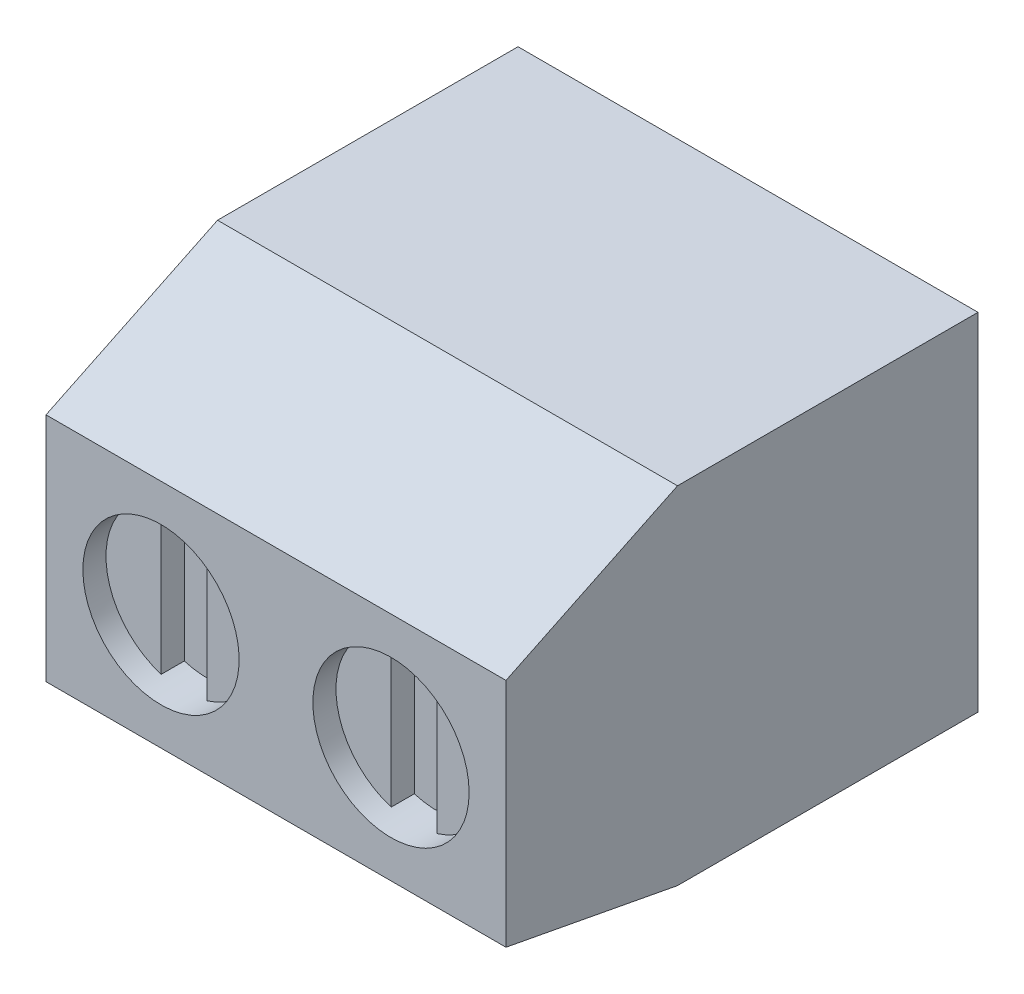
ISO-10303-21;
HEADER;
FILE_DESCRIPTION(('STEP AP214'),'2;1');
FILE_NAME('part.step','',(''),(''),'','','');
FILE_SCHEMA(('AUTOMOTIVE_DESIGN { 1 0 10303 214 1 1 1 1 }'));
ENDSEC;
DATA;
#1=APPLICATION_CONTEXT('core data for automotive mechanical design processes');
#2=APPLICATION_PROTOCOL_DEFINITION('international standard','automotive_design',2000,#1);
#3=PRODUCT_CONTEXT('',#1,'mechanical');
#4=PRODUCT('Part','Part','',(#3));
#5=PRODUCT_RELATED_PRODUCT_CATEGORY('part','',(#4));
#6=PRODUCT_DEFINITION_FORMATION('','',#4);
#7=PRODUCT_DEFINITION_CONTEXT('part definition',#1,'design');
#8=PRODUCT_DEFINITION('design','',#6,#7);
#9=PRODUCT_DEFINITION_SHAPE('','',#8);
#10=(LENGTH_UNIT() NAMED_UNIT(*) SI_UNIT(.MILLI.,.METRE.));
#11=(NAMED_UNIT(*) PLANE_ANGLE_UNIT() SI_UNIT($,.RADIAN.));
#12=(NAMED_UNIT(*) SI_UNIT($,.STERADIAN.) SOLID_ANGLE_UNIT());
#13=UNCERTAINTY_MEASURE_WITH_UNIT(LENGTH_MEASURE(1.E-05),#10,'distance_accuracy_value','');
#14=(GEOMETRIC_REPRESENTATION_CONTEXT(3) GLOBAL_UNCERTAINTY_ASSIGNED_CONTEXT((#13)) GLOBAL_UNIT_ASSIGNED_CONTEXT((#10,
#11,#12)) REPRESENTATION_CONTEXT('',''));
#15=CARTESIAN_POINT('',(0.,0.,0.));
#16=DIRECTION('',(0.,0.,1.));
#17=DIRECTION('',(1.,0.,0.));
#18=AXIS2_PLACEMENT_3D('',#15,#16,#17);
#19=CARTESIAN_POINT('',(-7.4625,3.1997519769774,9.71));
#20=DIRECTION('',(0.,0.,-1.));
#21=DIRECTION('',(-1.,0.,0.));
#22=AXIS2_PLACEMENT_3D('',#19,#20,#21);
#23=PLANE('',#22);
#24=DIRECTION('',(0.,1.,0.));
#25=VECTOR('',#24,1.);
#26=CARTESIAN_POINT('',(-6.96704564957599,1.58400911790423,9.71));
#27=LINE('',#26,#25);
#28=CARTESIAN_POINT('',(-6.96704564957599,1.58400911790423,9.71));
#29=VERTEX_POINT('',#28);
#30=CARTESIAN_POINT('',(-6.96704564957599,4.81549483605056,9.71));
#31=VERTEX_POINT('',#30);
#32=EDGE_CURVE('E294',#29,#31,#27,.T.);
#33=ORIENTED_EDGE('',*,*,#32,.F.);
#34=CARTESIAN_POINT('',(-7.4625,3.1997519769774,9.71));
#35=DIRECTION('',(0.,0.,1.));
#36=DIRECTION('',(-1.,0.,0.));
#37=AXIS2_PLACEMENT_3D('',#34,#35,#36);
#38=CIRCLE('',#37,1.69);
#39=EDGE_CURVE('E346',#29,#31,#38,.T.);
#40=ORIENTED_EDGE('',*,*,#39,.T.);
#41=EDGE_LOOP('',(#33,#40));
#42=FACE_BOUND('',#41,.T.);
#43=ADVANCED_FACE('F33',(#42),#23,.F.);
#44=DIRECTION('',(0.,-1.,0.));
#45=VECTOR('',#44,1.);
#46=CARTESIAN_POINT('',(-7.95795435042401,1.58400911790423,9.71));
#47=LINE('',#46,#45);
#48=CARTESIAN_POINT('',(-7.95795435042401,4.81549483605056,9.71));
#49=VERTEX_POINT('',#48);
#50=CARTESIAN_POINT('',(-7.95795435042401,1.58400911790423,9.71));
#51=VERTEX_POINT('',#50);
#52=EDGE_CURVE('E304',#49,#51,#47,.T.);
#53=ORIENTED_EDGE('',*,*,#52,.F.);
#54=EDGE_CURVE('E342',#49,#51,#38,.T.);
#55=ORIENTED_EDGE('',*,*,#54,.T.);
#56=EDGE_LOOP('',(#53,#55));
#57=FACE_BOUND('',#56,.T.);
#58=ADVANCED_FACE('F511',(#57),#23,.F.);
#59=CARTESIAN_POINT('',(-2.4875,3.1997519769774,9.71));
#60=DIRECTION('',(0.,0.,1.));
#61=DIRECTION('',(1.,0.,0.));
#62=AXIS2_PLACEMENT_3D('',#59,#60,#61);
#63=PLANE('',#62);
#64=DIRECTION('',(0.,-1.,0.));
#65=VECTOR('',#64,1.);
#66=CARTESIAN_POINT('',(-2.98295435042401,1.58400911790423,9.71));
#67=LINE('',#66,#65);
#68=CARTESIAN_POINT('',(-2.98295435042401,4.81549483605056,9.71));
#69=VERTEX_POINT('',#68);
#70=CARTESIAN_POINT('',(-2.98295435042401,1.58400911790423,9.71));
#71=VERTEX_POINT('',#70);
#72=EDGE_CURVE('E337',#69,#71,#67,.T.);
#73=ORIENTED_EDGE('',*,*,#72,.F.);
#74=CARTESIAN_POINT('',(-2.4875,3.1997519769774,9.71));
#75=DIRECTION('',(0.,0.,1.));
#76=DIRECTION('',(1.,0.,0.));
#77=AXIS2_PLACEMENT_3D('',#74,#75,#76);
#78=CIRCLE('',#77,1.69);
#79=EDGE_CURVE('E407',#69,#71,#78,.T.);
#80=ORIENTED_EDGE('',*,*,#79,.T.);
#81=EDGE_LOOP('',(#73,#80));
#82=FACE_BOUND('',#81,.T.);
#83=ADVANCED_FACE('F517',(#82),#63,.T.);
#84=CARTESIAN_POINT('',(0.,0.,10.21));
#85=DIRECTION('',(-1.,0.,0.));
#86=DIRECTION('',(0.,0.,1.));
#87=AXIS2_PLACEMENT_3D('',#84,#85,#86);
#88=PLANE('',#87);
#89=DIRECTION('',(0.,1.,0.));
#90=VECTOR('',#89,1.);
#91=CARTESIAN_POINT('',(0.,0.,10.21));
#92=LINE('',#91,#90);
#93=CARTESIAN_POINT('',(0.,0.699999999999996,10.21));
#94=VERTEX_POINT('',#93);
#95=CARTESIAN_POINT('',(0.,5.6995039539548,10.21));
#96=VERTEX_POINT('',#95);
#97=EDGE_CURVE('E432',#94,#96,#92,.T.);
#98=ORIENTED_EDGE('',*,*,#97,.F.);
#99=DIRECTION('',(0.,-0.185407859197824,-0.982661653748471));
#100=VECTOR('',#99,1.);
#101=CARTESIAN_POINT('',(0.,0.699999999999996,10.21));
#102=LINE('',#101,#100);
#103=CARTESIAN_POINT('',(0.,0.,6.5));
#104=VERTEX_POINT('',#103);
#105=EDGE_CURVE('E439',#94,#104,#102,.T.);
#106=ORIENTED_EDGE('',*,*,#105,.T.);
#107=DIRECTION('',(0.,0.,-1.));
#108=VECTOR('',#107,1.);
#109=CARTESIAN_POINT('',(0.,0.,10.21));
#110=LINE('',#109,#108);
#111=CARTESIAN_POINT('',(0.,0.,0.));
#112=VERTEX_POINT('',#111);
#113=EDGE_CURVE('E449',#104,#112,#110,.T.);
#114=ORIENTED_EDGE('',*,*,#113,.T.);
#115=DIRECTION('',(0.,1.,0.));
#116=VECTOR('',#115,1.);
#117=CARTESIAN_POINT('',(0.,0.,0.));
#118=LINE('',#117,#116);
#119=CARTESIAN_POINT('',(0.,7.49,0.));
#120=VERTEX_POINT('',#119);
#121=EDGE_CURVE('E458',#112,#120,#118,.T.);
#122=ORIENTED_EDGE('',*,*,#121,.T.);
#123=DIRECTION('',(0.,0.,-1.));
#124=VECTOR('',#123,1.);
#125=CARTESIAN_POINT('',(0.,7.49,10.21));
#126=LINE('',#125,#124);
#127=CARTESIAN_POINT('',(0.,7.49,6.5));
#128=VERTEX_POINT('',#127);
#129=EDGE_CURVE('E11',#128,#120,#126,.T.);
#130=ORIENTED_EDGE('',*,*,#129,.F.);
#131=DIRECTION('',(0.,-0.434643061495688,0.90060280317888));
#132=VECTOR('',#131,1.);
#133=CARTESIAN_POINT('',(0.,7.49,6.5));
#134=LINE('',#133,#132);
#135=EDGE_CURVE('E446',#128,#96,#134,.T.);
#136=ORIENTED_EDGE('',*,*,#135,.T.);
#137=EDGE_LOOP('',(#98,#106,#114,#122,#130,#136));
#138=FACE_BOUND('',#137,.T.);
#139=ADVANCED_FACE('F35',(#138),#88,.F.);
#140=CARTESIAN_POINT('',(0.,7.49,10.21));
#141=DIRECTION('',(0.,-1.,0.));
#142=DIRECTION('',(1.,0.,0.));
#143=AXIS2_PLACEMENT_3D('',#140,#141,#142);
#144=PLANE('',#143);
#145=DIRECTION('',(0.,0.,-1.));
#146=VECTOR('',#145,1.);
#147=CARTESIAN_POINT('',(-9.95,7.49,10.21));
#148=LINE('',#147,#146);
#149=CARTESIAN_POINT('',(-9.95,7.49,6.5));
#150=VERTEX_POINT('',#149);
#151=CARTESIAN_POINT('',(-9.95,7.49,0.));
#152=VERTEX_POINT('',#151);
#153=EDGE_CURVE('E42',#150,#152,#148,.T.);
#154=ORIENTED_EDGE('',*,*,#153,.F.);
#155=DIRECTION('',(-1.,0.,0.));
#156=VECTOR('',#155,1.);
#157=CARTESIAN_POINT('',(0.,7.49,6.5));
#158=LINE('',#157,#156);
#159=EDGE_CURVE('E455',#128,#150,#158,.T.);
#160=ORIENTED_EDGE('',*,*,#159,.F.);
#161=ORIENTED_EDGE('',*,*,#129,.T.);
#162=DIRECTION('',(-1.,0.,0.));
#163=VECTOR('',#162,1.);
#164=CARTESIAN_POINT('',(0.,7.49,0.));
#165=LINE('',#164,#163);
#166=EDGE_CURVE('E461',#120,#152,#165,.T.);
#167=ORIENTED_EDGE('',*,*,#166,.T.);
#168=EDGE_LOOP('',(#154,#160,#161,#167));
#169=FACE_BOUND('',#168,.T.);
#170=ADVANCED_FACE('F483',(#169),#144,.F.);
#171=CARTESIAN_POINT('',(-9.95,0.,10.21));
#172=DIRECTION('',(1.,0.,0.));
#173=DIRECTION('',(0.,0.,-1.));
#174=AXIS2_PLACEMENT_3D('',#171,#172,#173);
#175=PLANE('',#174);
#176=DIRECTION('',(0.,0.,-1.));
#177=VECTOR('',#176,1.);
#178=CARTESIAN_POINT('',(-9.95,0.,10.21));
#179=LINE('',#178,#177);
#180=CARTESIAN_POINT('',(-9.95,0.,6.5));
#181=VERTEX_POINT('',#180);
#182=CARTESIAN_POINT('',(-9.95,0.,0.));
#183=VERTEX_POINT('',#182);
#184=EDGE_CURVE('E468',#181,#183,#179,.T.);
#185=ORIENTED_EDGE('',*,*,#184,.F.);
#186=DIRECTION('',(0.,-0.185407859197824,-0.982661653748471));
#187=VECTOR('',#186,1.);
#188=CARTESIAN_POINT('',(-9.95,0.699999999999996,10.21));
#189=LINE('',#188,#187);
#190=CARTESIAN_POINT('',(-9.95,0.699999999999996,10.21));
#191=VERTEX_POINT('',#190);
#192=EDGE_CURVE('E488',#191,#181,#189,.T.);
#193=ORIENTED_EDGE('',*,*,#192,.F.);
#194=DIRECTION('',(0.,-1.,0.));
#195=VECTOR('',#194,1.);
#196=CARTESIAN_POINT('',(-9.95,0.,10.21));
#197=LINE('',#196,#195);
#198=CARTESIAN_POINT('',(-9.95,5.6995039539548,10.21));
#199=VERTEX_POINT('',#198);
#200=EDGE_CURVE('E435',#199,#191,#197,.T.);
#201=ORIENTED_EDGE('',*,*,#200,.F.);
#202=DIRECTION('',(0.,-0.434643061495688,0.90060280317888));
#203=VECTOR('',#202,1.);
#204=CARTESIAN_POINT('',(-9.95,7.49,6.5));
#205=LINE('',#204,#203);
#206=EDGE_CURVE('E479',#150,#199,#205,.T.);
#207=ORIENTED_EDGE('',*,*,#206,.F.);
#208=ORIENTED_EDGE('',*,*,#153,.T.);
#209=DIRECTION('',(0.,-1.,0.));
#210=VECTOR('',#209,1.);
#211=CARTESIAN_POINT('',(-9.95,0.,0.));
#212=LINE('',#211,#210);
#213=EDGE_CURVE('E452',#152,#183,#212,.T.);
#214=ORIENTED_EDGE('',*,*,#213,.T.);
#215=EDGE_LOOP('',(#185,#193,#201,#207,#208,#214));
#216=FACE_BOUND('',#215,.T.);
#217=ADVANCED_FACE('F476',(#216),#175,.F.);
#218=CARTESIAN_POINT('',(0.,0.,10.21));
#219=DIRECTION('',(0.,1.,0.));
#220=DIRECTION('',(-1.,0.,0.));
#221=AXIS2_PLACEMENT_3D('',#218,#219,#220);
#222=PLANE('',#221);
#223=DIRECTION('',(-1.,0.,0.));
#224=VECTOR('',#223,1.);
#225=CARTESIAN_POINT('',(-9.455,0.,6.08));
#226=LINE('',#225,#224);
#227=CARTESIAN_POINT('',(-5.475,0.,6.08));
#228=VERTEX_POINT('',#227);
#229=CARTESIAN_POINT('',(-9.455,0.,6.08));
#230=VERTEX_POINT('',#229);
#231=EDGE_CURVE('E621',#228,#230,#226,.T.);
#232=ORIENTED_EDGE('',*,*,#231,.F.);
#233=DIRECTION('',(0.,0.,1.));
#234=VECTOR('',#233,1.);
#235=CARTESIAN_POINT('',(-5.475,0.,1.));
#236=LINE('',#235,#234);
#237=CARTESIAN_POINT('',(-5.475,0.,1.));
#238=VERTEX_POINT('',#237);
#239=EDGE_CURVE('E624',#238,#228,#236,.T.);
#240=ORIENTED_EDGE('',*,*,#239,.F.);
#241=DIRECTION('',(1.,0.,0.));
#242=VECTOR('',#241,1.);
#243=CARTESIAN_POINT('',(-9.455,0.,1.));
#244=LINE('',#243,#242);
#245=CARTESIAN_POINT('',(-9.455,0.,1.));
#246=VERTEX_POINT('',#245);
#247=EDGE_CURVE('E614',#246,#238,#244,.T.);
#248=ORIENTED_EDGE('',*,*,#247,.F.);
#249=DIRECTION('',(0.,0.,-1.));
#250=VECTOR('',#249,1.);
#251=CARTESIAN_POINT('',(-9.455,0.,1.));
#252=LINE('',#251,#250);
#253=EDGE_CURVE('E618',#230,#246,#252,.T.);
#254=ORIENTED_EDGE('',*,*,#253,.F.);
#255=EDGE_LOOP('',(#232,#240,#248,#254));
#256=FACE_BOUND('',#255,.T.);
#257=DIRECTION('',(0.,0.,1.));
#258=VECTOR('',#257,1.);
#259=CARTESIAN_POINT('',(-0.494999999999999,0.,1.));
#260=LINE('',#259,#258);
#261=CARTESIAN_POINT('',(-0.494999999999999,0.,1.));
#262=VERTEX_POINT('',#261);
#263=CARTESIAN_POINT('',(-0.494999999999999,0.,6.08));
#264=VERTEX_POINT('',#263);
#265=EDGE_CURVE('E575',#262,#264,#260,.T.);
#266=ORIENTED_EDGE('',*,*,#265,.F.);
#267=DIRECTION('',(1.,0.,0.));
#268=VECTOR('',#267,1.);
#269=CARTESIAN_POINT('',(-0.494999999999999,0.,1.));
#270=LINE('',#269,#268);
#271=CARTESIAN_POINT('',(-4.475,0.,1.));
#272=VERTEX_POINT('',#271);
#273=EDGE_CURVE('E566',#272,#262,#270,.T.);
#274=ORIENTED_EDGE('',*,*,#273,.F.);
#275=DIRECTION('',(0.,0.,-1.));
#276=VECTOR('',#275,1.);
#277=CARTESIAN_POINT('',(-4.475,0.,1.));
#278=LINE('',#277,#276);
#279=CARTESIAN_POINT('',(-4.475,0.,6.08));
#280=VERTEX_POINT('',#279);
#281=EDGE_CURVE('E588',#280,#272,#278,.T.);
#282=ORIENTED_EDGE('',*,*,#281,.F.);
#283=DIRECTION('',(-1.,0.,0.));
#284=VECTOR('',#283,1.);
#285=CARTESIAN_POINT('',(-0.494999999999999,0.,6.08));
#286=LINE('',#285,#284);
#287=EDGE_CURVE('E586',#264,#280,#286,.T.);
#288=ORIENTED_EDGE('',*,*,#287,.F.);
#289=EDGE_LOOP('',(#266,#274,#282,#288));
#290=FACE_BOUND('',#289,.T.);
#291=ORIENTED_EDGE('',*,*,#113,.F.);
#292=DIRECTION('',(-1.,0.,0.));
#293=VECTOR('',#292,1.);
#294=CARTESIAN_POINT('',(0.,0.,6.5));
#295=LINE('',#294,#293);
#296=EDGE_CURVE('E438',#104,#181,#295,.T.);
#297=ORIENTED_EDGE('',*,*,#296,.T.);
#298=ORIENTED_EDGE('',*,*,#184,.T.);
#299=DIRECTION('',(1.,0.,0.));
#300=VECTOR('',#299,1.);
#301=CARTESIAN_POINT('',(0.,0.,0.));
#302=LINE('',#301,#300);
#303=EDGE_CURVE('E447',#183,#112,#302,.T.);
#304=ORIENTED_EDGE('',*,*,#303,.T.);
#305=EDGE_LOOP('',(#291,#297,#298,#304));
#306=FACE_BOUND('',#305,.T.);
#307=ADVANCED_FACE('F422',(#256,#290,#306),#222,.F.);
#308=CARTESIAN_POINT('',(0.,0.,10.21));
#309=DIRECTION('',(0.,0.,1.));
#310=DIRECTION('',(1.,0.,0.));
#311=AXIS2_PLACEMENT_3D('',#308,#309,#310);
#312=PLANE('',#311);
#313=CARTESIAN_POINT('',(-2.4875,3.1997519769774,10.21));
#314=DIRECTION('',(0.,0.,1.));
#315=DIRECTION('',(1.,0.,0.));
#316=AXIS2_PLACEMENT_3D('',#313,#314,#315);
#317=CIRCLE('',#316,1.69);
#318=CARTESIAN_POINT('',(-0.7975,3.1997519769774,10.21));
#319=VERTEX_POINT('',#318);
#320=EDGE_CURVE('E370',#319,#319,#317,.T.);
#321=ORIENTED_EDGE('',*,*,#320,.F.);
#322=EDGE_LOOP('',(#321));
#323=FACE_BOUND('',#322,.T.);
#324=CARTESIAN_POINT('',(-7.4625,3.1997519769774,10.21));
#325=DIRECTION('',(0.,0.,1.));
#326=DIRECTION('',(-1.,0.,0.));
#327=AXIS2_PLACEMENT_3D('',#324,#325,#326);
#328=CIRCLE('',#327,1.69);
#329=CARTESIAN_POINT('',(-9.1525,3.1997519769774,10.21));
#330=VERTEX_POINT('',#329);
#331=EDGE_CURVE('E347',#330,#330,#328,.T.);
#332=ORIENTED_EDGE('',*,*,#331,.F.);
#333=EDGE_LOOP('',(#332));
#334=FACE_BOUND('',#333,.T.);
#335=DIRECTION('',(-1.,0.,0.));
#336=VECTOR('',#335,1.);
#337=CARTESIAN_POINT('',(0.,0.699999999999996,10.21));
#338=LINE('',#337,#336);
#339=EDGE_CURVE('E429',#94,#191,#338,.T.);
#340=ORIENTED_EDGE('',*,*,#339,.F.);
#341=ORIENTED_EDGE('',*,*,#97,.T.);
#342=DIRECTION('',(-1.,0.,0.));
#343=VECTOR('',#342,1.);
#344=CARTESIAN_POINT('',(0.,5.6995039539548,10.21));
#345=LINE('',#344,#343);
#346=EDGE_CURVE('E462',#96,#199,#345,.T.);
#347=ORIENTED_EDGE('',*,*,#346,.T.);
#348=ORIENTED_EDGE('',*,*,#200,.T.);
#349=EDGE_LOOP('',(#340,#341,#347,#348));
#350=FACE_BOUND('',#349,.T.);
#351=ADVANCED_FACE('F418',(#323,#334,#350),#312,.T.);
#352=CARTESIAN_POINT('',(0.,0.,0.));
#353=DIRECTION('',(0.,0.,1.));
#354=DIRECTION('',(1.,0.,0.));
#355=AXIS2_PLACEMENT_3D('',#352,#353,#354);
#356=PLANE('',#355);
#357=ORIENTED_EDGE('',*,*,#121,.F.);
#358=ORIENTED_EDGE('',*,*,#303,.F.);
#359=ORIENTED_EDGE('',*,*,#213,.F.);
#360=ORIENTED_EDGE('',*,*,#166,.F.);
#361=EDGE_LOOP('',(#357,#358,#359,#360));
#362=FACE_BOUND('',#361,.T.);
#363=ADVANCED_FACE('F421',(#362),#356,.F.);
#364=CARTESIAN_POINT('',(0.,7.49,6.5));
#365=DIRECTION('',(0.,-0.900602803178879,-0.434643061495688));
#366=DIRECTION('',(0.,0.434643061495688,-0.90060280317888));
#367=AXIS2_PLACEMENT_3D('',#364,#365,#366);
#368=PLANE('',#367);
#369=ORIENTED_EDGE('',*,*,#206,.T.);
#370=ORIENTED_EDGE('',*,*,#346,.F.);
#371=ORIENTED_EDGE('',*,*,#135,.F.);
#372=ORIENTED_EDGE('',*,*,#159,.T.);
#373=EDGE_LOOP('',(#369,#370,#371,#372));
#374=FACE_BOUND('',#373,.T.);
#375=ADVANCED_FACE('F499',(#374),#368,.F.);
#376=CARTESIAN_POINT('',(0.,0.699999999999996,10.21));
#377=DIRECTION('',(0.,0.982661653748471,-0.185407859197824));
#378=DIRECTION('',(0.,0.185407859197824,0.982661653748471));
#379=AXIS2_PLACEMENT_3D('',#376,#377,#378);
#380=PLANE('',#379);
#381=ORIENTED_EDGE('',*,*,#192,.T.);
#382=ORIENTED_EDGE('',*,*,#296,.F.);
#383=ORIENTED_EDGE('',*,*,#105,.F.);
#384=ORIENTED_EDGE('',*,*,#339,.T.);
#385=EDGE_LOOP('',(#381,#382,#383,#384));
#386=FACE_BOUND('',#385,.T.);
#387=ADVANCED_FACE('F501',(#386),#380,.F.);
#388=CARTESIAN_POINT('',(-0.494999999999999,1.,1.));
#389=DIRECTION('',(0.,0.,-1.));
#390=DIRECTION('',(-1.,0.,0.));
#391=AXIS2_PLACEMENT_3D('',#388,#389,#390);
#392=PLANE('',#391);
#393=ORIENTED_EDGE('',*,*,#273,.T.);
#394=DIRECTION('',(0.,-1.,0.));
#395=VECTOR('',#394,1.);
#396=CARTESIAN_POINT('',(-0.494999999999999,1.,1.));
#397=LINE('',#396,#395);
#398=CARTESIAN_POINT('',(-0.494999999999999,1.,1.));
#399=VERTEX_POINT('',#398);
#400=EDGE_CURVE('E569',#399,#262,#397,.T.);
#401=ORIENTED_EDGE('',*,*,#400,.F.);
#402=DIRECTION('',(1.,0.,0.));
#403=VECTOR('',#402,1.);
#404=CARTESIAN_POINT('',(-0.494999999999999,1.,1.));
#405=LINE('',#404,#403);
#406=CARTESIAN_POINT('',(-4.475,0.999999999999999,1.));
#407=VERTEX_POINT('',#406);
#408=EDGE_CURVE('E592',#407,#399,#405,.T.);
#409=ORIENTED_EDGE('',*,*,#408,.F.);
#410=DIRECTION('',(0.,-1.,0.));
#411=VECTOR('',#410,1.);
#412=CARTESIAN_POINT('',(-4.475,0.999999999999999,1.));
#413=LINE('',#412,#411);
#414=EDGE_CURVE('E489',#407,#272,#413,.T.);
#415=ORIENTED_EDGE('',*,*,#414,.T.);
#416=EDGE_LOOP('',(#393,#401,#409,#415));
#417=FACE_BOUND('',#416,.T.);
#418=ADVANCED_FACE('F507',(#417),#392,.F.);
#419=CARTESIAN_POINT('',(-4.475,0.999999999999999,1.));
#420=DIRECTION('',(-1.,0.,0.));
#421=DIRECTION('',(0.,0.,1.));
#422=AXIS2_PLACEMENT_3D('',#419,#420,#421);
#423=PLANE('',#422);
#424=ORIENTED_EDGE('',*,*,#281,.T.);
#425=ORIENTED_EDGE('',*,*,#414,.F.);
#426=DIRECTION('',(0.,0.,-1.));
#427=VECTOR('',#426,1.);
#428=CARTESIAN_POINT('',(-4.475,0.999999999999999,1.));
#429=LINE('',#428,#427);
#430=CARTESIAN_POINT('',(-4.475,0.999999999999999,6.08));
#431=VERTEX_POINT('',#430);
#432=EDGE_CURVE('E584',#431,#407,#429,.T.);
#433=ORIENTED_EDGE('',*,*,#432,.F.);
#434=DIRECTION('',(0.,-1.,0.));
#435=VECTOR('',#434,1.);
#436=CARTESIAN_POINT('',(-4.475,0.999999999999999,6.08));
#437=LINE('',#436,#435);
#438=EDGE_CURVE('E492',#431,#280,#437,.T.);
#439=ORIENTED_EDGE('',*,*,#438,.T.);
#440=EDGE_LOOP('',(#424,#425,#433,#439));
#441=FACE_BOUND('',#440,.T.);
#442=ADVANCED_FACE('F550',(#441),#423,.F.);
#443=CARTESIAN_POINT('',(-0.494999999999999,1.,6.08));
#444=DIRECTION('',(0.,0.,1.));
#445=DIRECTION('',(1.,0.,0.));
#446=AXIS2_PLACEMENT_3D('',#443,#444,#445);
#447=PLANE('',#446);
#448=ORIENTED_EDGE('',*,*,#287,.T.);
#449=ORIENTED_EDGE('',*,*,#438,.F.);
#450=DIRECTION('',(-1.,0.,0.));
#451=VECTOR('',#450,1.);
#452=CARTESIAN_POINT('',(-0.494999999999999,1.,6.08));
#453=LINE('',#452,#451);
#454=CARTESIAN_POINT('',(-0.494999999999999,1.,6.08));
#455=VERTEX_POINT('',#454);
#456=EDGE_CURVE('E597',#455,#431,#453,.T.);
#457=ORIENTED_EDGE('',*,*,#456,.F.);
#458=DIRECTION('',(0.,-1.,0.));
#459=VECTOR('',#458,1.);
#460=CARTESIAN_POINT('',(-0.494999999999999,1.,6.08));
#461=LINE('',#460,#459);
#462=EDGE_CURVE('E583',#455,#264,#461,.T.);
#463=ORIENTED_EDGE('',*,*,#462,.T.);
#464=EDGE_LOOP('',(#448,#449,#457,#463));
#465=FACE_BOUND('',#464,.T.);
#466=ADVANCED_FACE('F553',(#465),#447,.F.);
#467=CARTESIAN_POINT('',(-0.494999999999999,1.,1.));
#468=DIRECTION('',(1.,0.,0.));
#469=DIRECTION('',(0.,1.,0.));
#470=AXIS2_PLACEMENT_3D('',#467,#468,#469);
#471=PLANE('',#470);
#472=ORIENTED_EDGE('',*,*,#265,.T.);
#473=ORIENTED_EDGE('',*,*,#462,.F.);
#474=DIRECTION('',(0.,0.,1.));
#475=VECTOR('',#474,1.);
#476=CARTESIAN_POINT('',(-0.494999999999999,1.,1.));
#477=LINE('',#476,#475);
#478=EDGE_CURVE('E581',#399,#455,#477,.T.);
#479=ORIENTED_EDGE('',*,*,#478,.F.);
#480=ORIENTED_EDGE('',*,*,#400,.T.);
#481=EDGE_LOOP('',(#472,#473,#479,#480));
#482=FACE_BOUND('',#481,.T.);
#483=ADVANCED_FACE('F548',(#482),#471,.F.);
#484=CARTESIAN_POINT('',(0.,1.,0.));
#485=DIRECTION('',(0.,1.,0.));
#486=DIRECTION('',(-1.,0.,0.));
#487=AXIS2_PLACEMENT_3D('',#484,#485,#486);
#488=PLANE('',#487);
#489=DIRECTION('',(0.,0.,1.));
#490=VECTOR('',#489,1.);
#491=CARTESIAN_POINT('',(-0.925042398142428,1.,2.27468032829032));
#492=LINE('',#491,#490);
#493=CARTESIAN_POINT('',(-0.925042398142428,1.,2.27468032829032));
#494=VERTEX_POINT('',#493);
#495=CARTESIAN_POINT('',(-0.925042398142428,1.,4.80531967170968));
#496=VERTEX_POINT('',#495);
#497=EDGE_CURVE('E284',#494,#496,#492,.T.);
#498=ORIENTED_EDGE('',*,*,#497,.F.);
#499=DIRECTION('',(1.,0.,0.));
#500=VECTOR('',#499,1.);
#501=CARTESIAN_POINT('',(-0.925042398142428,1.,2.27468032829032));
#502=LINE('',#501,#500);
#503=CARTESIAN_POINT('',(-4.04495760185757,1.,2.27468032829032));
#504=VERTEX_POINT('',#503);
#505=EDGE_CURVE('E58',#504,#494,#502,.T.);
#506=ORIENTED_EDGE('',*,*,#505,.F.);
#507=DIRECTION('',(0.,0.,-1.));
#508=VECTOR('',#507,1.);
#509=CARTESIAN_POINT('',(-4.04495760185757,1.,2.27468032829032));
#510=LINE('',#509,#508);
#511=CARTESIAN_POINT('',(-4.04495760185757,1.,4.80531967170968));
#512=VERTEX_POINT('',#511);
#513=EDGE_CURVE('E273',#512,#504,#510,.T.);
#514=ORIENTED_EDGE('',*,*,#513,.F.);
#515=DIRECTION('',(-1.,0.,0.));
#516=VECTOR('',#515,1.);
#517=CARTESIAN_POINT('',(-0.925042398142428,1.,4.80531967170968));
#518=LINE('',#517,#516);
#519=EDGE_CURVE('E287',#496,#512,#518,.T.);
#520=ORIENTED_EDGE('',*,*,#519,.F.);
#521=EDGE_LOOP('',(#498,#506,#514,#520));
#522=FACE_BOUND('',#521,.T.);
#523=ORIENTED_EDGE('',*,*,#408,.T.);
#524=ORIENTED_EDGE('',*,*,#478,.T.);
#525=ORIENTED_EDGE('',*,*,#456,.T.);
#526=ORIENTED_EDGE('',*,*,#432,.T.);
#527=EDGE_LOOP('',(#523,#524,#525,#526));
#528=FACE_BOUND('',#527,.T.);
#529=ADVANCED_FACE('F544',(#522,#528),#488,.F.);
#530=CARTESIAN_POINT('',(-5.475,0.999999999999999,1.));
#531=DIRECTION('',(1.,0.,0.));
#532=DIRECTION('',(0.,0.,-1.));
#533=AXIS2_PLACEMENT_3D('',#530,#531,#532);
#534=PLANE('',#533);
#535=ORIENTED_EDGE('',*,*,#239,.T.);
#536=DIRECTION('',(0.,-1.,0.));
#537=VECTOR('',#536,1.);
#538=CARTESIAN_POINT('',(-5.475,0.999999999999999,6.08));
#539=LINE('',#538,#537);
#540=CARTESIAN_POINT('',(-5.475,0.999999999999999,6.08));
#541=VERTEX_POINT('',#540);
#542=EDGE_CURVE('E605',#541,#228,#539,.T.);
#543=ORIENTED_EDGE('',*,*,#542,.F.);
#544=DIRECTION('',(0.,0.,1.));
#545=VECTOR('',#544,1.);
#546=CARTESIAN_POINT('',(-5.475,0.999999999999999,1.));
#547=LINE('',#546,#545);
#548=CARTESIAN_POINT('',(-5.475,0.999999999999999,1.));
#549=VERTEX_POINT('',#548);
#550=EDGE_CURVE('E617',#549,#541,#547,.T.);
#551=ORIENTED_EDGE('',*,*,#550,.F.);
#552=DIRECTION('',(0.,-1.,0.));
#553=VECTOR('',#552,1.);
#554=CARTESIAN_POINT('',(-5.475,0.999999999999999,1.));
#555=LINE('',#554,#553);
#556=EDGE_CURVE('E576',#549,#238,#555,.T.);
#557=ORIENTED_EDGE('',*,*,#556,.T.);
#558=EDGE_LOOP('',(#535,#543,#551,#557));
#559=FACE_BOUND('',#558,.T.);
#560=ADVANCED_FACE('F534',(#559),#534,.F.);
#561=CARTESIAN_POINT('',(-9.455,0.999999999999999,1.));
#562=DIRECTION('',(0.,0.,-1.));
#563=DIRECTION('',(-1.,0.,0.));
#564=AXIS2_PLACEMENT_3D('',#561,#562,#563);
#565=PLANE('',#564);
#566=ORIENTED_EDGE('',*,*,#247,.T.);
#567=ORIENTED_EDGE('',*,*,#556,.F.);
#568=DIRECTION('',(1.,0.,0.));
#569=VECTOR('',#568,1.);
#570=CARTESIAN_POINT('',(-9.455,0.999999999999999,1.));
#571=LINE('',#570,#569);
#572=CARTESIAN_POINT('',(-9.455,0.999999999999999,1.));
#573=VERTEX_POINT('',#572);
#574=EDGE_CURVE('E609',#573,#549,#571,.T.);
#575=ORIENTED_EDGE('',*,*,#574,.F.);
#576=DIRECTION('',(0.,-1.,0.));
#577=VECTOR('',#576,1.);
#578=CARTESIAN_POINT('',(-9.455,0.999999999999999,1.));
#579=LINE('',#578,#577);
#580=EDGE_CURVE('E611',#573,#246,#579,.T.);
#581=ORIENTED_EDGE('',*,*,#580,.T.);
#582=EDGE_LOOP('',(#566,#567,#575,#581));
#583=FACE_BOUND('',#582,.T.);
#584=ADVANCED_FACE('F530',(#583),#565,.F.);
#585=CARTESIAN_POINT('',(-9.455,0.999999999999999,1.));
#586=DIRECTION('',(-1.,0.,0.));
#587=DIRECTION('',(0.,-1.,0.));
#588=AXIS2_PLACEMENT_3D('',#585,#586,#587);
#589=PLANE('',#588);
#590=ORIENTED_EDGE('',*,*,#253,.T.);
#591=ORIENTED_EDGE('',*,*,#580,.F.);
#592=DIRECTION('',(0.,0.,-1.));
#593=VECTOR('',#592,1.);
#594=CARTESIAN_POINT('',(-9.455,0.999999999999999,1.));
#595=LINE('',#594,#593);
#596=CARTESIAN_POINT('',(-9.455,0.999999999999999,6.08));
#597=VERTEX_POINT('',#596);
#598=EDGE_CURVE('E628',#597,#573,#595,.T.);
#599=ORIENTED_EDGE('',*,*,#598,.F.);
#600=DIRECTION('',(0.,-1.,0.));
#601=VECTOR('',#600,1.);
#602=CARTESIAN_POINT('',(-9.455,0.999999999999999,6.08));
#603=LINE('',#602,#601);
#604=EDGE_CURVE('E608',#597,#230,#603,.T.);
#605=ORIENTED_EDGE('',*,*,#604,.T.);
#606=EDGE_LOOP('',(#590,#591,#599,#605));
#607=FACE_BOUND('',#606,.T.);
#608=ADVANCED_FACE('F533',(#607),#589,.F.);
#609=CARTESIAN_POINT('',(-9.455,0.999999999999999,6.08));
#610=DIRECTION('',(0.,0.,1.));
#611=DIRECTION('',(1.,0.,0.));
#612=AXIS2_PLACEMENT_3D('',#609,#610,#611);
#613=PLANE('',#612);
#614=ORIENTED_EDGE('',*,*,#231,.T.);
#615=ORIENTED_EDGE('',*,*,#604,.F.);
#616=DIRECTION('',(-1.,0.,0.));
#617=VECTOR('',#616,1.);
#618=CARTESIAN_POINT('',(-9.455,0.999999999999999,6.08));
#619=LINE('',#618,#617);
#620=EDGE_CURVE('E631',#541,#597,#619,.T.);
#621=ORIENTED_EDGE('',*,*,#620,.F.);
#622=ORIENTED_EDGE('',*,*,#542,.T.);
#623=EDGE_LOOP('',(#614,#615,#621,#622));
#624=FACE_BOUND('',#623,.T.);
#625=ADVANCED_FACE('F528',(#624),#613,.F.);
#626=CARTESIAN_POINT('',(0.,1.,0.));
#627=DIRECTION('',(0.,1.,0.));
#628=DIRECTION('',(-1.,0.,0.));
#629=AXIS2_PLACEMENT_3D('',#626,#627,#628);
#630=PLANE('',#629);
#631=DIRECTION('',(-1.,0.,0.));
#632=VECTOR('',#631,1.);
#633=CARTESIAN_POINT('',(-9.02495760185757,0.999999999999999,4.80531967170968));
#634=LINE('',#633,#632);
#635=CARTESIAN_POINT('',(-5.90504239814243,0.999999999999999,4.80531967170968));
#636=VERTEX_POINT('',#635);
#637=CARTESIAN_POINT('',(-9.02495760185757,0.999999999999999,4.80531967170968));
#638=VERTEX_POINT('',#637);
#639=EDGE_CURVE('E260',#636,#638,#634,.T.);
#640=ORIENTED_EDGE('',*,*,#639,.F.);
#641=DIRECTION('',(0.,0.,1.));
#642=VECTOR('',#641,1.);
#643=CARTESIAN_POINT('',(-5.90504239814243,0.999999999999999,2.27468032829032));
#644=LINE('',#643,#642);
#645=CARTESIAN_POINT('',(-5.90504239814243,0.999999999999999,2.27468032829032));
#646=VERTEX_POINT('',#645);
#647=EDGE_CURVE('E50',#646,#636,#644,.T.);
#648=ORIENTED_EDGE('',*,*,#647,.F.);
#649=DIRECTION('',(1.,0.,0.));
#650=VECTOR('',#649,1.);
#651=CARTESIAN_POINT('',(-9.02495760185757,0.999999999999999,2.27468032829032));
#652=LINE('',#651,#650);
#653=CARTESIAN_POINT('',(-9.02495760185757,0.999999999999999,2.27468032829032));
#654=VERTEX_POINT('',#653);
#655=EDGE_CURVE('E251',#654,#646,#652,.T.);
#656=ORIENTED_EDGE('',*,*,#655,.F.);
#657=DIRECTION('',(0.,0.,-1.));
#658=VECTOR('',#657,1.);
#659=CARTESIAN_POINT('',(-9.02495760185757,0.999999999999999,2.27468032829032));
#660=LINE('',#659,#658);
#661=EDGE_CURVE('E254',#638,#654,#660,.T.);
#662=ORIENTED_EDGE('',*,*,#661,.F.);
#663=EDGE_LOOP('',(#640,#648,#656,#662));
#664=FACE_BOUND('',#663,.T.);
#665=ORIENTED_EDGE('',*,*,#550,.T.);
#666=ORIENTED_EDGE('',*,*,#620,.T.);
#667=ORIENTED_EDGE('',*,*,#598,.T.);
#668=ORIENTED_EDGE('',*,*,#574,.T.);
#669=EDGE_LOOP('',(#665,#666,#667,#668));
#670=FACE_BOUND('',#669,.T.);
#671=ADVANCED_FACE('F525',(#664,#670),#630,.F.);
#672=CARTESIAN_POINT('',(-7.4625,3.1997519769774,9.71));
#673=DIRECTION('',(0.,0.,1.));
#674=DIRECTION('',(1.,0.,0.));
#675=AXIS2_PLACEMENT_3D('',#672,#673,#674);
#676=CYLINDRICAL_SURFACE('',#675,1.69);
#677=ORIENTED_EDGE('',*,*,#39,.F.);
#678=DIRECTION('',(0.,0.,1.));
#679=VECTOR('',#678,1.);
#680=CARTESIAN_POINT('',(-6.96704564957599,1.58400911790423,9.21));
#681=LINE('',#680,#679);
#682=CARTESIAN_POINT('',(-6.96704564957599,1.58400911790423,9.21));
#683=VERTEX_POINT('',#682);
#684=EDGE_CURVE('E313',#683,#29,#681,.T.);
#685=ORIENTED_EDGE('',*,*,#684,.F.);
#686=CARTESIAN_POINT('',(-7.4625,3.1997519769774,9.21));
#687=DIRECTION('',(0.,0.,1.));
#688=DIRECTION('',(-1.,0.,0.));
#689=AXIS2_PLACEMENT_3D('',#686,#687,#688);
#690=CIRCLE('',#689,1.69);
#691=CARTESIAN_POINT('',(-7.95795435042401,1.58400911790423,9.21));
#692=VERTEX_POINT('',#691);
#693=EDGE_CURVE('E300',#692,#683,#690,.T.);
#694=ORIENTED_EDGE('',*,*,#693,.F.);
#695=DIRECTION('',(0.,0.,1.));
#696=VECTOR('',#695,1.);
#697=CARTESIAN_POINT('',(-7.95795435042401,1.58400911790423,9.21));
#698=LINE('',#697,#696);
#699=EDGE_CURVE('E328',#692,#51,#698,.T.);
#700=ORIENTED_EDGE('',*,*,#699,.T.);
#701=ORIENTED_EDGE('',*,*,#54,.F.);
#702=DIRECTION('',(0.,0.,1.));
#703=VECTOR('',#702,1.);
#704=CARTESIAN_POINT('',(-7.95795435042401,4.81549483605056,9.21));
#705=LINE('',#704,#703);
#706=CARTESIAN_POINT('',(-7.95795435042401,4.81549483605056,9.21));
#707=VERTEX_POINT('',#706);
#708=EDGE_CURVE('E324',#707,#49,#705,.T.);
#709=ORIENTED_EDGE('',*,*,#708,.F.);
#710=CARTESIAN_POINT('',(-7.4625,3.1997519769774,9.21));
#711=DIRECTION('',(0.,0.,1.));
#712=DIRECTION('',(-1.,0.,0.));
#713=AXIS2_PLACEMENT_3D('',#710,#711,#712);
#714=CIRCLE('',#713,1.69);
#715=CARTESIAN_POINT('',(-6.96704564957599,4.81549483605056,9.21));
#716=VERTEX_POINT('',#715);
#717=EDGE_CURVE('E307',#716,#707,#714,.T.);
#718=ORIENTED_EDGE('',*,*,#717,.F.);
#719=DIRECTION('',(0.,0.,1.));
#720=VECTOR('',#719,1.);
#721=CARTESIAN_POINT('',(-6.96704564957599,4.81549483605056,9.21));
#722=LINE('',#721,#720);
#723=EDGE_CURVE('E323',#716,#31,#722,.T.);
#724=ORIENTED_EDGE('',*,*,#723,.T.);
#725=EDGE_LOOP('',(#677,#685,#694,#700,#701,#709,#718,#724));
#726=FACE_BOUND('',#725,.T.);
#727=ORIENTED_EDGE('',*,*,#331,.T.);
#728=EDGE_LOOP('',(#727));
#729=FACE_BOUND('',#728,.T.);
#730=ADVANCED_FACE('F522',(#726,#729),#676,.F.);
#731=CARTESIAN_POINT('',(-2.4875,3.1997519769774,9.71));
#732=DIRECTION('',(0.,0.,1.));
#733=DIRECTION('',(1.,0.,0.));
#734=AXIS2_PLACEMENT_3D('',#731,#732,#733);
#735=CYLINDRICAL_SURFACE('',#734,1.69);
#736=ORIENTED_EDGE('',*,*,#79,.F.);
#737=DIRECTION('',(0.,0.,1.));
#738=VECTOR('',#737,1.);
#739=CARTESIAN_POINT('',(-2.98295435042401,4.81549483605056,9.21));
#740=LINE('',#739,#738);
#741=CARTESIAN_POINT('',(-2.98295435042401,4.81549483605056,9.21));
#742=VERTEX_POINT('',#741);
#743=EDGE_CURVE('E356',#742,#69,#740,.T.);
#744=ORIENTED_EDGE('',*,*,#743,.F.);
#745=CARTESIAN_POINT('',(-2.4875,3.1997519769774,9.21));
#746=DIRECTION('',(0.,0.,1.));
#747=DIRECTION('',(1.,0.,0.));
#748=AXIS2_PLACEMENT_3D('',#745,#746,#747);
#749=CIRCLE('',#748,1.69);
#750=CARTESIAN_POINT('',(-1.99204564957599,4.81549483605056,9.21));
#751=VERTEX_POINT('',#750);
#752=EDGE_CURVE('E376',#751,#742,#749,.T.);
#753=ORIENTED_EDGE('',*,*,#752,.F.);
#754=DIRECTION('',(0.,0.,1.));
#755=VECTOR('',#754,1.);
#756=CARTESIAN_POINT('',(-1.99204564957599,4.81549483605056,9.21));
#757=LINE('',#756,#755);
#758=CARTESIAN_POINT('',(-1.99204564957599,4.81549483605056,9.71));
#759=VERTEX_POINT('',#758);
#760=EDGE_CURVE('E381',#751,#759,#757,.T.);
#761=ORIENTED_EDGE('',*,*,#760,.T.);
#762=CARTESIAN_POINT('',(-1.99204564957599,1.58400911790423,9.71));
#763=VERTEX_POINT('',#762);
#764=EDGE_CURVE('E377',#763,#759,#78,.T.);
#765=ORIENTED_EDGE('',*,*,#764,.F.);
#766=DIRECTION('',(0.,0.,1.));
#767=VECTOR('',#766,1.);
#768=CARTESIAN_POINT('',(-1.99204564957599,1.58400911790423,9.21));
#769=LINE('',#768,#767);
#770=CARTESIAN_POINT('',(-1.99204564957599,1.58400911790423,9.21));
#771=VERTEX_POINT('',#770);
#772=EDGE_CURVE('E355',#771,#763,#769,.T.);
#773=ORIENTED_EDGE('',*,*,#772,.F.);
#774=CARTESIAN_POINT('',(-2.4875,3.1997519769774,9.21));
#775=DIRECTION('',(0.,0.,1.));
#776=DIRECTION('',(1.,0.,0.));
#777=AXIS2_PLACEMENT_3D('',#774,#775,#776);
#778=CIRCLE('',#777,1.69);
#779=CARTESIAN_POINT('',(-2.98295435042401,1.58400911790423,9.21));
#780=VERTEX_POINT('',#779);
#781=EDGE_CURVE('E390',#780,#771,#778,.T.);
#782=ORIENTED_EDGE('',*,*,#781,.F.);
#783=DIRECTION('',(0.,0.,1.));
#784=VECTOR('',#783,1.);
#785=CARTESIAN_POINT('',(-2.98295435042401,1.58400911790423,9.21));
#786=LINE('',#785,#784);
#787=EDGE_CURVE('E353',#780,#71,#786,.T.);
#788=ORIENTED_EDGE('',*,*,#787,.T.);
#789=EDGE_LOOP('',(#736,#744,#753,#761,#765,#773,#782,#788));
#790=FACE_BOUND('',#789,.T.);
#791=ORIENTED_EDGE('',*,*,#320,.T.);
#792=EDGE_LOOP('',(#791));
#793=FACE_BOUND('',#792,.T.);
#794=ADVANCED_FACE('F403',(#790,#793),#735,.F.);
#795=DIRECTION('',(0.,1.,0.));
#796=VECTOR('',#795,1.);
#797=CARTESIAN_POINT('',(-1.99204564957599,1.58400911790423,9.71));
#798=LINE('',#797,#796);
#799=EDGE_CURVE('E360',#763,#759,#798,.T.);
#800=ORIENTED_EDGE('',*,*,#799,.F.);
#801=ORIENTED_EDGE('',*,*,#764,.T.);
#802=EDGE_LOOP('',(#800,#801));
#803=FACE_BOUND('',#802,.T.);
#804=ADVANCED_FACE('F414',(#803),#63,.T.);
#805=CARTESIAN_POINT('',(-1.99204564957599,1.58400911790423,9.21));
#806=DIRECTION('',(1.,0.,0.));
#807=DIRECTION('',(0.,0.,-1.));
#808=AXIS2_PLACEMENT_3D('',#805,#806,#807);
#809=PLANE('',#808);
#810=ORIENTED_EDGE('',*,*,#799,.T.);
#811=ORIENTED_EDGE('',*,*,#760,.F.);
#812=DIRECTION('',(0.,1.,0.));
#813=VECTOR('',#812,1.);
#814=CARTESIAN_POINT('',(-1.99204564957599,1.58400911790423,9.21));
#815=LINE('',#814,#813);
#816=EDGE_CURVE('E366',#771,#751,#815,.T.);
#817=ORIENTED_EDGE('',*,*,#816,.F.);
#818=ORIENTED_EDGE('',*,*,#772,.T.);
#819=EDGE_LOOP('',(#810,#811,#817,#818));
#820=FACE_BOUND('',#819,.T.);
#821=ADVANCED_FACE('F412',(#820),#809,.F.);
#822=CARTESIAN_POINT('',(-2.98295435042401,1.58400911790423,9.21));
#823=DIRECTION('',(-1.,0.,0.));
#824=DIRECTION('',(0.,0.,1.));
#825=AXIS2_PLACEMENT_3D('',#822,#823,#824);
#826=PLANE('',#825);
#827=ORIENTED_EDGE('',*,*,#72,.T.);
#828=ORIENTED_EDGE('',*,*,#787,.F.);
#829=DIRECTION('',(0.,-1.,0.));
#830=VECTOR('',#829,1.);
#831=CARTESIAN_POINT('',(-2.98295435042401,1.58400911790423,9.21));
#832=LINE('',#831,#830);
#833=EDGE_CURVE('E395',#742,#780,#832,.T.);
#834=ORIENTED_EDGE('',*,*,#833,.F.);
#835=ORIENTED_EDGE('',*,*,#743,.T.);
#836=EDGE_LOOP('',(#827,#828,#834,#835));
#837=FACE_BOUND('',#836,.T.);
#838=ADVANCED_FACE('F408',(#837),#826,.F.);
#839=CARTESIAN_POINT('',(-2.4875,3.1997519769774,9.21));
#840=DIRECTION('',(0.,0.,1.));
#841=DIRECTION('',(1.,0.,0.));
#842=AXIS2_PLACEMENT_3D('',#839,#840,#841);
#843=PLANE('',#842);
#844=ORIENTED_EDGE('',*,*,#752,.T.);
#845=ORIENTED_EDGE('',*,*,#833,.T.);
#846=ORIENTED_EDGE('',*,*,#781,.T.);
#847=ORIENTED_EDGE('',*,*,#816,.T.);
#848=EDGE_LOOP('',(#844,#845,#846,#847));
#849=FACE_BOUND('',#848,.T.);
#850=ADVANCED_FACE('F400',(#849),#843,.T.);
#851=CARTESIAN_POINT('',(-7.95795435042401,1.58400911790423,9.21));
#852=DIRECTION('',(-1.,0.,0.));
#853=DIRECTION('',(0.,0.,1.));
#854=AXIS2_PLACEMENT_3D('',#851,#852,#853);
#855=PLANE('',#854);
#856=ORIENTED_EDGE('',*,*,#52,.T.);
#857=ORIENTED_EDGE('',*,*,#699,.F.);
#858=DIRECTION('',(0.,-1.,0.));
#859=VECTOR('',#858,1.);
#860=CARTESIAN_POINT('',(-7.95795435042401,1.58400911790423,9.21));
#861=LINE('',#860,#859);
#862=EDGE_CURVE('E310',#707,#692,#861,.T.);
#863=ORIENTED_EDGE('',*,*,#862,.F.);
#864=ORIENTED_EDGE('',*,*,#708,.T.);
#865=EDGE_LOOP('',(#856,#857,#863,#864));
#866=FACE_BOUND('',#865,.T.);
#867=ADVANCED_FACE('F831',(#866),#855,.F.);
#868=CARTESIAN_POINT('',(-6.96704564957599,1.58400911790423,9.21));
#869=DIRECTION('',(1.,0.,0.));
#870=DIRECTION('',(0.,0.,-1.));
#871=AXIS2_PLACEMENT_3D('',#868,#869,#870);
#872=PLANE('',#871);
#873=ORIENTED_EDGE('',*,*,#32,.T.);
#874=ORIENTED_EDGE('',*,*,#723,.F.);
#875=DIRECTION('',(0.,1.,0.));
#876=VECTOR('',#875,1.);
#877=CARTESIAN_POINT('',(-6.96704564957599,1.58400911790423,9.21));
#878=LINE('',#877,#876);
#879=EDGE_CURVE('E303',#683,#716,#878,.T.);
#880=ORIENTED_EDGE('',*,*,#879,.F.);
#881=ORIENTED_EDGE('',*,*,#684,.T.);
#882=EDGE_LOOP('',(#873,#874,#880,#881));
#883=FACE_BOUND('',#882,.T.);
#884=ADVANCED_FACE('F839',(#883),#872,.F.);
#885=CARTESIAN_POINT('',(-7.4625,3.1997519769774,9.21));
#886=DIRECTION('',(0.,0.,-1.));
#887=DIRECTION('',(-1.,0.,0.));
#888=AXIS2_PLACEMENT_3D('',#885,#886,#887);
#889=PLANE('',#888);
#890=ORIENTED_EDGE('',*,*,#693,.T.);
#891=ORIENTED_EDGE('',*,*,#879,.T.);
#892=ORIENTED_EDGE('',*,*,#717,.T.);
#893=ORIENTED_EDGE('',*,*,#862,.T.);
#894=EDGE_LOOP('',(#890,#891,#892,#893));
#895=FACE_BOUND('',#894,.T.);
#896=ADVANCED_FACE('F848',(#895),#889,.F.);
#897=CARTESIAN_POINT('',(-0.925042398142428,3.,2.27468032829032));
#898=DIRECTION('',(0.,0.,-1.));
#899=DIRECTION('',(0.,1.,0.));
#900=AXIS2_PLACEMENT_3D('',#897,#898,#899);
#901=PLANE('',#900);
#902=ORIENTED_EDGE('',*,*,#505,.T.);
#903=DIRECTION('',(0.,-1.,0.));
#904=VECTOR('',#903,1.);
#905=CARTESIAN_POINT('',(-0.925042398142428,3.,2.27468032829032));
#906=LINE('',#905,#904);
#907=CARTESIAN_POINT('',(-0.925042398142428,3.,2.27468032829032));
#908=VERTEX_POINT('',#907);
#909=EDGE_CURVE('E282',#908,#494,#906,.T.);
#910=ORIENTED_EDGE('',*,*,#909,.F.);
#911=DIRECTION('',(1.,0.,0.));
#912=VECTOR('',#911,1.);
#913=CARTESIAN_POINT('',(-0.925042398142428,3.,2.27468032829032));
#914=LINE('',#913,#912);
#915=CARTESIAN_POINT('',(-4.04495760185757,3.,2.27468032829032));
#916=VERTEX_POINT('',#915);
#917=EDGE_CURVE('E269',#916,#908,#914,.T.);
#918=ORIENTED_EDGE('',*,*,#917,.F.);
#919=DIRECTION('',(0.,-1.,0.));
#920=VECTOR('',#919,1.);
#921=CARTESIAN_POINT('',(-4.04495760185757,3.,2.27468032829032));
#922=LINE('',#921,#920);
#923=EDGE_CURVE('E292',#916,#504,#922,.T.);
#924=ORIENTED_EDGE('',*,*,#923,.T.);
#925=EDGE_LOOP('',(#902,#910,#918,#924));
#926=FACE_BOUND('',#925,.T.);
#927=ADVANCED_FACE('F855',(#926),#901,.F.);
#928=CARTESIAN_POINT('',(-4.04495760185757,3.,2.27468032829032));
#929=DIRECTION('',(-1.,0.,0.));
#930=DIRECTION('',(0.,-1.,0.));
#931=AXIS2_PLACEMENT_3D('',#928,#929,#930);
#932=PLANE('',#931);
#933=ORIENTED_EDGE('',*,*,#513,.T.);
#934=ORIENTED_EDGE('',*,*,#923,.F.);
#935=DIRECTION('',(0.,0.,-1.));
#936=VECTOR('',#935,1.);
#937=CARTESIAN_POINT('',(-4.04495760185757,3.,2.27468032829032));
#938=LINE('',#937,#936);
#939=CARTESIAN_POINT('',(-4.04495760185757,3.,4.80531967170968));
#940=VERTEX_POINT('',#939);
#941=EDGE_CURVE('E279',#940,#916,#938,.T.);
#942=ORIENTED_EDGE('',*,*,#941,.F.);
#943=DIRECTION('',(0.,-1.,0.));
#944=VECTOR('',#943,1.);
#945=CARTESIAN_POINT('',(-4.04495760185757,3.,4.80531967170968));
#946=LINE('',#945,#944);
#947=EDGE_CURVE('E295',#940,#512,#946,.T.);
#948=ORIENTED_EDGE('',*,*,#947,.T.);
#949=EDGE_LOOP('',(#933,#934,#942,#948));
#950=FACE_BOUND('',#949,.T.);
#951=ADVANCED_FACE('F863',(#950),#932,.F.);
#952=CARTESIAN_POINT('',(-0.925042398142428,3.,4.80531967170968));
#953=DIRECTION('',(0.,0.,1.));
#954=DIRECTION('',(0.,-1.,0.));
#955=AXIS2_PLACEMENT_3D('',#952,#953,#954);
#956=PLANE('',#955);
#957=ORIENTED_EDGE('',*,*,#519,.T.);
#958=ORIENTED_EDGE('',*,*,#947,.F.);
#959=DIRECTION('',(-1.,0.,0.));
#960=VECTOR('',#959,1.);
#961=CARTESIAN_POINT('',(-0.925042398142428,3.,4.80531967170968));
#962=LINE('',#961,#960);
#963=CARTESIAN_POINT('',(-0.925042398142428,3.,4.80531967170968));
#964=VERTEX_POINT('',#963);
#965=EDGE_CURVE('E276',#964,#940,#962,.T.);
#966=ORIENTED_EDGE('',*,*,#965,.F.);
#967=DIRECTION('',(0.,-1.,0.));
#968=VECTOR('',#967,1.);
#969=CARTESIAN_POINT('',(-0.925042398142428,3.,4.80531967170968));
#970=LINE('',#969,#968);
#971=EDGE_CURVE('E297',#964,#496,#970,.T.);
#972=ORIENTED_EDGE('',*,*,#971,.T.);
#973=EDGE_LOOP('',(#957,#958,#966,#972));
#974=FACE_BOUND('',#973,.T.);
#975=ADVANCED_FACE('F871',(#974),#956,.F.);
#976=CARTESIAN_POINT('',(-0.925042398142428,3.,2.27468032829032));
#977=DIRECTION('',(1.,0.,0.));
#978=DIRECTION('',(0.,1.,0.));
#979=AXIS2_PLACEMENT_3D('',#976,#977,#978);
#980=PLANE('',#979);
#981=ORIENTED_EDGE('',*,*,#497,.T.);
#982=ORIENTED_EDGE('',*,*,#971,.F.);
#983=DIRECTION('',(0.,0.,1.));
#984=VECTOR('',#983,1.);
#985=CARTESIAN_POINT('',(-0.925042398142428,3.,2.27468032829032));
#986=LINE('',#985,#984);
#987=EDGE_CURVE('E272',#908,#964,#986,.T.);
#988=ORIENTED_EDGE('',*,*,#987,.F.);
#989=ORIENTED_EDGE('',*,*,#909,.T.);
#990=EDGE_LOOP('',(#981,#982,#988,#989));
#991=FACE_BOUND('',#990,.T.);
#992=ADVANCED_FACE('F880',(#991),#980,.F.);
#993=CARTESIAN_POINT('',(0.,3.,0.));
#994=DIRECTION('',(0.,1.,0.));
#995=DIRECTION('',(-1.,0.,0.));
#996=AXIS2_PLACEMENT_3D('',#993,#994,#995);
#997=PLANE('',#996);
#998=ORIENTED_EDGE('',*,*,#917,.T.);
#999=ORIENTED_EDGE('',*,*,#987,.T.);
#1000=ORIENTED_EDGE('',*,*,#965,.T.);
#1001=ORIENTED_EDGE('',*,*,#941,.T.);
#1002=EDGE_LOOP('',(#998,#999,#1000,#1001));
#1003=FACE_BOUND('',#1002,.T.);
#1004=ADVANCED_FACE('F889',(#1003),#997,.F.);
#1005=CARTESIAN_POINT('',(-5.90504239814243,3.,2.27468032829032));
#1006=DIRECTION('',(1.,0.,0.));
#1007=DIRECTION('',(0.,1.,0.));
#1008=AXIS2_PLACEMENT_3D('',#1005,#1006,#1007);
#1009=PLANE('',#1008);
#1010=ORIENTED_EDGE('',*,*,#647,.T.);
#1011=DIRECTION('',(0.,-1.,0.));
#1012=VECTOR('',#1011,1.);
#1013=CARTESIAN_POINT('',(-5.90504239814243,3.,4.80531967170968));
#1014=LINE('',#1013,#1012);
#1015=CARTESIAN_POINT('',(-5.90504239814243,3.,4.80531967170968));
#1016=VERTEX_POINT('',#1015);
#1017=EDGE_CURVE('E229',#1016,#636,#1014,.T.);
#1018=ORIENTED_EDGE('',*,*,#1017,.F.);
#1019=DIRECTION('',(0.,0.,1.));
#1020=VECTOR('',#1019,1.);
#1021=CARTESIAN_POINT('',(-5.90504239814243,3.,2.27468032829032));
#1022=LINE('',#1021,#1020);
#1023=CARTESIAN_POINT('',(-5.90504239814243,3.,2.27468032829032));
#1024=VERTEX_POINT('',#1023);
#1025=EDGE_CURVE('E233',#1024,#1016,#1022,.T.);
#1026=ORIENTED_EDGE('',*,*,#1025,.F.);
#1027=DIRECTION('',(0.,-1.,0.));
#1028=VECTOR('',#1027,1.);
#1029=CARTESIAN_POINT('',(-5.90504239814243,3.,2.27468032829032));
#1030=LINE('',#1029,#1028);
#1031=EDGE_CURVE('E264',#1024,#646,#1030,.T.);
#1032=ORIENTED_EDGE('',*,*,#1031,.T.);
#1033=EDGE_LOOP('',(#1010,#1018,#1026,#1032));
#1034=FACE_BOUND('',#1033,.T.);
#1035=ADVANCED_FACE('F231',(#1034),#1009,.F.);
#1036=CARTESIAN_POINT('',(-9.02495760185757,3.,2.27468032829032));
#1037=DIRECTION('',(0.,0.,-1.));
#1038=DIRECTION('',(0.,1.,0.));
#1039=AXIS2_PLACEMENT_3D('',#1036,#1037,#1038);
#1040=PLANE('',#1039);
#1041=ORIENTED_EDGE('',*,*,#655,.T.);
#1042=ORIENTED_EDGE('',*,*,#1031,.F.);
#1043=DIRECTION('',(1.,0.,0.));
#1044=VECTOR('',#1043,1.);
#1045=CARTESIAN_POINT('',(-9.02495760185757,3.,2.27468032829032));
#1046=LINE('',#1045,#1044);
#1047=CARTESIAN_POINT('',(-9.02495760185757,3.,2.27468032829032));
#1048=VERTEX_POINT('',#1047);
#1049=EDGE_CURVE('E239',#1048,#1024,#1046,.T.);
#1050=ORIENTED_EDGE('',*,*,#1049,.F.);
#1051=DIRECTION('',(0.,-1.,0.));
#1052=VECTOR('',#1051,1.);
#1053=CARTESIAN_POINT('',(-9.02495760185757,3.,2.27468032829032));
#1054=LINE('',#1053,#1052);
#1055=EDGE_CURVE('E266',#1048,#654,#1054,.T.);
#1056=ORIENTED_EDGE('',*,*,#1055,.T.);
#1057=EDGE_LOOP('',(#1041,#1042,#1050,#1056));
#1058=FACE_BOUND('',#1057,.T.);
#1059=ADVANCED_FACE('F906',(#1058),#1040,.F.);
#1060=CARTESIAN_POINT('',(-9.02495760185757,3.,2.27468032829032));
#1061=DIRECTION('',(-1.,0.,0.));
#1062=DIRECTION('',(0.,-1.,0.));
#1063=AXIS2_PLACEMENT_3D('',#1060,#1061,#1062);
#1064=PLANE('',#1063);
#1065=ORIENTED_EDGE('',*,*,#661,.T.);
#1066=ORIENTED_EDGE('',*,*,#1055,.F.);
#1067=DIRECTION('',(0.,0.,-1.));
#1068=VECTOR('',#1067,1.);
#1069=CARTESIAN_POINT('',(-9.02495760185757,3.,2.27468032829032));
#1070=LINE('',#1069,#1068);
#1071=CARTESIAN_POINT('',(-9.02495760185757,3.,4.80531967170968));
#1072=VERTEX_POINT('',#1071);
#1073=EDGE_CURVE('E247',#1072,#1048,#1070,.T.);
#1074=ORIENTED_EDGE('',*,*,#1073,.F.);
#1075=DIRECTION('',(0.,-1.,0.));
#1076=VECTOR('',#1075,1.);
#1077=CARTESIAN_POINT('',(-9.02495760185757,3.,4.80531967170968));
#1078=LINE('',#1077,#1076);
#1079=EDGE_CURVE('E238',#1072,#638,#1078,.T.);
#1080=ORIENTED_EDGE('',*,*,#1079,.T.);
#1081=EDGE_LOOP('',(#1065,#1066,#1074,#1080));
#1082=FACE_BOUND('',#1081,.T.);
#1083=ADVANCED_FACE('F914',(#1082),#1064,.F.);
#1084=CARTESIAN_POINT('',(-9.02495760185757,3.,4.80531967170968));
#1085=DIRECTION('',(0.,0.,1.));
#1086=DIRECTION('',(0.,-1.,0.));
#1087=AXIS2_PLACEMENT_3D('',#1084,#1085,#1086);
#1088=PLANE('',#1087);
#1089=ORIENTED_EDGE('',*,*,#639,.T.);
#1090=ORIENTED_EDGE('',*,*,#1079,.F.);
#1091=DIRECTION('',(-1.,0.,0.));
#1092=VECTOR('',#1091,1.);
#1093=CARTESIAN_POINT('',(-9.02495760185757,3.,4.80531967170968));
#1094=LINE('',#1093,#1092);
#1095=EDGE_CURVE('E242',#1016,#1072,#1094,.T.);
#1096=ORIENTED_EDGE('',*,*,#1095,.F.);
#1097=ORIENTED_EDGE('',*,*,#1017,.T.);
#1098=EDGE_LOOP('',(#1089,#1090,#1096,#1097));
#1099=FACE_BOUND('',#1098,.T.);
#1100=ADVANCED_FACE('F243',(#1099),#1088,.F.);
#1101=CARTESIAN_POINT('',(0.,3.,0.));
#1102=DIRECTION('',(0.,1.,0.));
#1103=DIRECTION('',(-1.,0.,0.));
#1104=AXIS2_PLACEMENT_3D('',#1101,#1102,#1103);
#1105=PLANE('',#1104);
#1106=ORIENTED_EDGE('',*,*,#1025,.T.);
#1107=ORIENTED_EDGE('',*,*,#1095,.T.);
#1108=ORIENTED_EDGE('',*,*,#1073,.T.);
#1109=ORIENTED_EDGE('',*,*,#1049,.T.);
#1110=EDGE_LOOP('',(#1106,#1107,#1108,#1109));
#1111=FACE_BOUND('',#1110,.T.);
#1112=ADVANCED_FACE('F249',(#1111),#1105,.F.);
#1113=CLOSED_SHELL('',(#43,#58,#83,#139,#170,#217,#307,#351,#363,#375,#387,#418,#442,#466,#483,
#529,#560,#584,#608,#625,#671,#730,#794,#804,#821,#838,#850,#867,#884,#896,#927,#951,#975,#992,
#1004,#1035,#1059,#1083,#1100,#1112));
#1114=MANIFOLD_SOLID_BREP('B2',#1113);
#1115=ADVANCED_BREP_SHAPE_REPRESENTATION('',(#18,#1114),#14);
#1116=SHAPE_DEFINITION_REPRESENTATION(#9,#1115);
ENDSEC;
END-ISO-10303-21;
